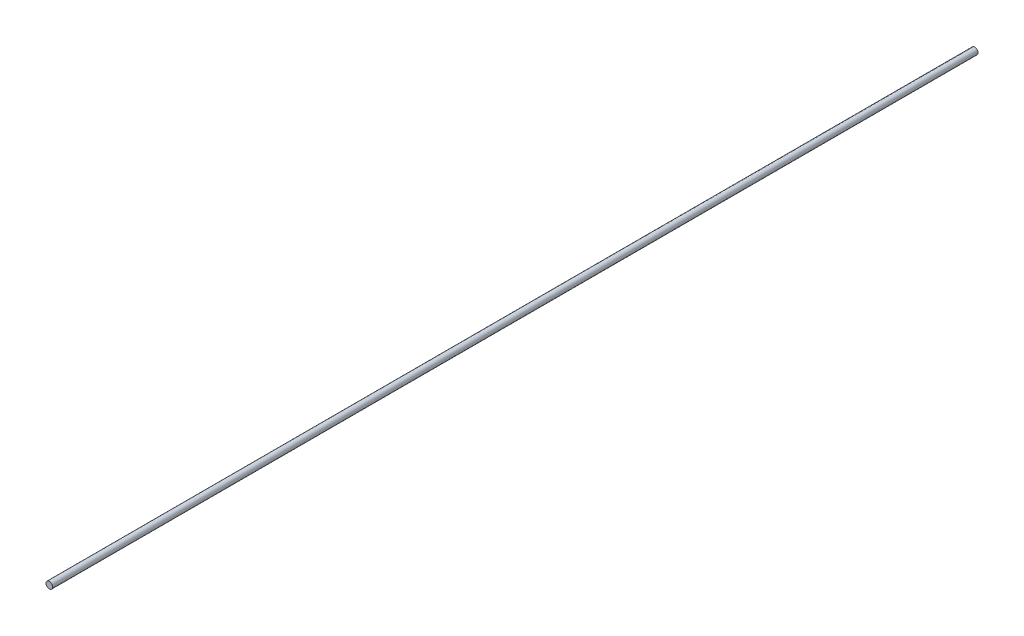
ISO-10303-21;
HEADER;
FILE_DESCRIPTION(('STEP AP214'),'2;1');
FILE_NAME('part.step','',(''),(''),'','','');
FILE_SCHEMA(('AUTOMOTIVE_DESIGN { 1 0 10303 214 1 1 1 1 }'));
ENDSEC;
DATA;
#1=APPLICATION_CONTEXT('core data for automotive mechanical design processes');
#2=APPLICATION_PROTOCOL_DEFINITION('international standard','automotive_design',2000,#1);
#3=PRODUCT_CONTEXT('',#1,'mechanical');
#4=PRODUCT('Part','Part','',(#3));
#5=PRODUCT_RELATED_PRODUCT_CATEGORY('part','',(#4));
#6=PRODUCT_DEFINITION_FORMATION('','',#4);
#7=PRODUCT_DEFINITION_CONTEXT('part definition',#1,'design');
#8=PRODUCT_DEFINITION('design','',#6,#7);
#9=PRODUCT_DEFINITION_SHAPE('','',#8);
#10=(LENGTH_UNIT() NAMED_UNIT(*) SI_UNIT(.MILLI.,.METRE.));
#11=(NAMED_UNIT(*) PLANE_ANGLE_UNIT() SI_UNIT($,.RADIAN.));
#12=(NAMED_UNIT(*) SI_UNIT($,.STERADIAN.) SOLID_ANGLE_UNIT());
#13=UNCERTAINTY_MEASURE_WITH_UNIT(LENGTH_MEASURE(1.E-05),#10,'distance_accuracy_value','');
#14=(GEOMETRIC_REPRESENTATION_CONTEXT(3) GLOBAL_UNCERTAINTY_ASSIGNED_CONTEXT((#13)) GLOBAL_UNIT_ASSIGNED_CONTEXT((#10,
#11,#12)) REPRESENTATION_CONTEXT('',''));
#15=CARTESIAN_POINT('',(0.,0.,0.));
#16=DIRECTION('',(0.,0.,1.));
#17=DIRECTION('',(1.,0.,0.));
#18=AXIS2_PLACEMENT_3D('',#15,#16,#17);
#19=CARTESIAN_POINT('',(-13.1320754716977,3.45283018867804,1700.));
#20=DIRECTION('',(0.,0.,-1.));
#21=DIRECTION('',(-1.,0.,0.));
#22=AXIS2_PLACEMENT_3D('',#19,#20,#21);
#23=CYLINDRICAL_SURFACE('',#22,6.);
#24=CARTESIAN_POINT('',(-13.1320754716977,3.45283018867804,1700.));
#25=DIRECTION('',(0.,0.,1.));
#26=DIRECTION('',(1.,0.,0.));
#27=AXIS2_PLACEMENT_3D('',#24,#25,#26);
#28=CIRCLE('',#27,6.);
#29=CARTESIAN_POINT('',(-7.1320754716977,3.45283018867804,1700.));
#30=VERTEX_POINT('',#29);
#31=EDGE_CURVE('E10',#30,#30,#28,.T.);
#32=ORIENTED_EDGE('',*,*,#31,.F.);
#33=EDGE_LOOP('',(#32));
#34=FACE_BOUND('',#33,.T.);
#35=CARTESIAN_POINT('',(-13.1320754716975,3.45283018867804,-8.88178419700125E-13));
#36=DIRECTION('',(0.,0.,1.));
#37=DIRECTION('',(1.,0.,0.));
#38=AXIS2_PLACEMENT_3D('',#35,#36,#37);
#39=CIRCLE('',#38,6.);
#40=CARTESIAN_POINT('',(-7.13207547169748,3.45283018867804,-8.88188166700327E-13));
#41=VERTEX_POINT('',#40);
#42=EDGE_CURVE('E33',#41,#41,#39,.T.);
#43=ORIENTED_EDGE('',*,*,#42,.T.);
#44=EDGE_LOOP('',(#43));
#45=FACE_BOUND('',#44,.T.);
#46=ADVANCED_FACE('F30',(#34,#45),#23,.T.);
#47=CARTESIAN_POINT('',(-13.1320754716977,3.45283018867804,1700.));
#48=DIRECTION('',(0.,0.,1.));
#49=DIRECTION('',(1.,0.,0.));
#50=AXIS2_PLACEMENT_3D('',#47,#48,#49);
#51=PLANE('',#50);
#52=ORIENTED_EDGE('',*,*,#31,.T.);
#53=EDGE_LOOP('',(#52));
#54=FACE_BOUND('',#53,.T.);
#55=ADVANCED_FACE('F45',(#54),#51,.T.);
#56=CARTESIAN_POINT('',(-13.1320754716975,3.45283018867804,-8.88178419700125E-13));
#57=DIRECTION('',(0.,0.,1.));
#58=DIRECTION('',(1.,0.,0.));
#59=AXIS2_PLACEMENT_3D('',#56,#57,#58);
#60=PLANE('',#59);
#61=ORIENTED_EDGE('',*,*,#42,.F.);
#62=EDGE_LOOP('',(#61));
#63=FACE_BOUND('',#62,.T.);
#64=ADVANCED_FACE('F43',(#63),#60,.F.);
#65=CLOSED_SHELL('',(#46,#55,#64));
#66=MANIFOLD_SOLID_BREP('B2',#65);
#67=ADVANCED_BREP_SHAPE_REPRESENTATION('',(#18,#66),#14);
#68=SHAPE_DEFINITION_REPRESENTATION(#9,#67);
ENDSEC;
END-ISO-10303-21;
